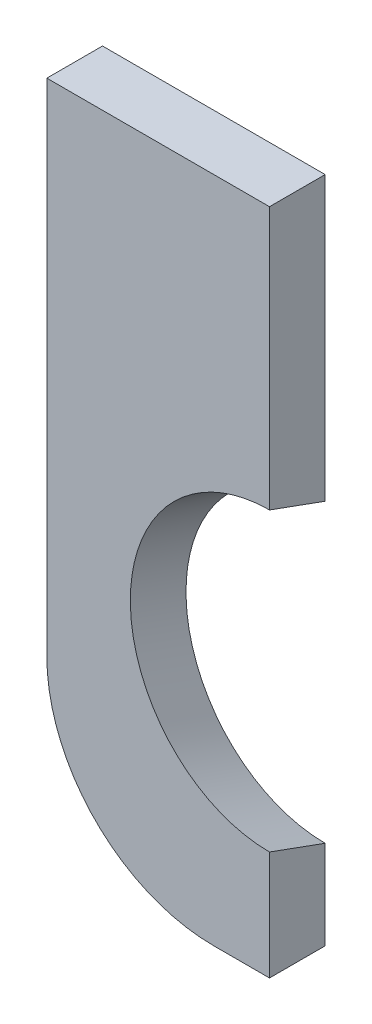
ISO-10303-21;
HEADER;
FILE_DESCRIPTION(('STEP AP214'),'2;1');
FILE_NAME('part.step','',(''),(''),'','','');
FILE_SCHEMA(('AUTOMOTIVE_DESIGN { 1 0 10303 214 1 1 1 1 }'));
ENDSEC;
DATA;
#1=APPLICATION_CONTEXT('core data for automotive mechanical design processes');
#2=APPLICATION_PROTOCOL_DEFINITION('international standard','automotive_design',2000,#1);
#3=PRODUCT_CONTEXT('',#1,'mechanical');
#4=PRODUCT('Part','Part','',(#3));
#5=PRODUCT_RELATED_PRODUCT_CATEGORY('part','',(#4));
#6=PRODUCT_DEFINITION_FORMATION('','',#4);
#7=PRODUCT_DEFINITION_CONTEXT('part definition',#1,'design');
#8=PRODUCT_DEFINITION('design','',#6,#7);
#9=PRODUCT_DEFINITION_SHAPE('','',#8);
#10=(LENGTH_UNIT() NAMED_UNIT(*) SI_UNIT(.MILLI.,.METRE.));
#11=(NAMED_UNIT(*) PLANE_ANGLE_UNIT() SI_UNIT($,.RADIAN.));
#12=(NAMED_UNIT(*) SI_UNIT($,.STERADIAN.) SOLID_ANGLE_UNIT());
#13=UNCERTAINTY_MEASURE_WITH_UNIT(LENGTH_MEASURE(1.E-05),#10,'distance_accuracy_value','');
#14=(GEOMETRIC_REPRESENTATION_CONTEXT(3) GLOBAL_UNCERTAINTY_ASSIGNED_CONTEXT((#13)) GLOBAL_UNIT_ASSIGNED_CONTEXT((#10,
#11,#12)) REPRESENTATION_CONTEXT('',''));
#15=CARTESIAN_POINT('',(0.,0.,0.));
#16=DIRECTION('',(0.,0.,1.));
#17=DIRECTION('',(1.,0.,0.));
#18=AXIS2_PLACEMENT_3D('',#15,#16,#17);
#19=CARTESIAN_POINT('',(40.,0.,10.));
#20=DIRECTION('',(-1.,0.,0.));
#21=DIRECTION('',(0.,0.,1.));
#22=AXIS2_PLACEMENT_3D('',#19,#20,#21);
#23=PLANE('',#22);
#24=DIRECTION('',(0.,1.,0.));
#25=VECTOR('',#24,1.);
#26=CARTESIAN_POINT('',(40.,0.,10.));
#27=LINE('',#26,#25);
#28=CARTESIAN_POINT('',(40.,72.8112575535963,10.));
#29=VERTEX_POINT('',#28);
#30=CARTESIAN_POINT('',(40.,120.,10.));
#31=VERTEX_POINT('',#30);
#32=EDGE_CURVE('E88',#29,#31,#27,.T.);
#33=ORIENTED_EDGE('',*,*,#32,.F.);
#34=DIRECTION('',(0.,-0.342020143325669,-0.939692620785908));
#35=VECTOR('',#34,1.);
#36=CARTESIAN_POINT('',(40.,78.3312918123781,25.1661694806188));
#37=LINE('',#36,#35);
#38=CARTESIAN_POINT('',(40.,69.1715552109343,0.));
#39=VERTEX_POINT('',#38);
#40=EDGE_CURVE('E145',#29,#39,#37,.T.);
#41=ORIENTED_EDGE('',*,*,#40,.T.);
#42=DIRECTION('',(0.,1.,0.));
#43=VECTOR('',#42,1.);
#44=CARTESIAN_POINT('',(40.,0.,0.));
#45=LINE('',#44,#43);
#46=CARTESIAN_POINT('',(40.,120.,0.));
#47=VERTEX_POINT('',#46);
#48=EDGE_CURVE('E126',#39,#47,#45,.T.);
#49=ORIENTED_EDGE('',*,*,#48,.T.);
#50=DIRECTION('',(0.,0.,-1.));
#51=VECTOR('',#50,1.);
#52=CARTESIAN_POINT('',(40.,120.,10.));
#53=LINE('',#52,#51);
#54=EDGE_CURVE('E41',#31,#47,#53,.T.);
#55=ORIENTED_EDGE('',*,*,#54,.F.);
#56=EDGE_LOOP('',(#33,#41,#49,#55));
#57=FACE_BOUND('',#56,.T.);
#58=ADVANCED_FACE('F33',(#57),#23,.F.);
#59=CARTESIAN_POINT('',(40.,0.,0.));
#60=VERTEX_POINT('',#59);
#61=CARTESIAN_POINT('',(40.,15.9626665871387,0.));
#62=VERTEX_POINT('',#61);
#63=EDGE_CURVE('E122',#60,#62,#45,.T.);
#64=ORIENTED_EDGE('',*,*,#63,.T.);
#65=DIRECTION('',(0.,-0.342020143325669,-0.939692620785908));
#66=VECTOR('',#65,1.);
#67=CARTESIAN_POINT('',(40.,31.3466607730827,42.2671766469023));
#68=LINE('',#67,#66);
#69=CARTESIAN_POINT('',(40.,19.6023689298007,10.));
#70=VERTEX_POINT('',#69);
#71=EDGE_CURVE('E47',#70,#62,#68,.T.);
#72=ORIENTED_EDGE('',*,*,#71,.F.);
#73=CARTESIAN_POINT('',(40.,0.,10.));
#74=VERTEX_POINT('',#73);
#75=EDGE_CURVE('E153',#74,#70,#27,.T.);
#76=ORIENTED_EDGE('',*,*,#75,.F.);
#77=DIRECTION('',(0.,0.,-1.));
#78=VECTOR('',#77,1.);
#79=CARTESIAN_POINT('',(40.,0.,10.));
#80=LINE('',#79,#78);
#81=EDGE_CURVE('E118',#74,#60,#80,.T.);
#82=ORIENTED_EDGE('',*,*,#81,.T.);
#83=EDGE_LOOP('',(#64,#72,#76,#82));
#84=FACE_BOUND('',#83,.T.);
#85=ADVANCED_FACE('F35',(#84),#23,.F.);
#86=CARTESIAN_POINT('',(0.,120.,10.));
#87=DIRECTION('',(0.,-1.,0.));
#88=DIRECTION('',(0.,0.,-1.));
#89=AXIS2_PLACEMENT_3D('',#86,#87,#88);
#90=PLANE('',#89);
#91=DIRECTION('',(-1.,0.,0.));
#92=VECTOR('',#91,1.);
#93=CARTESIAN_POINT('',(0.,120.,0.));
#94=LINE('',#93,#92);
#95=CARTESIAN_POINT('',(0.,120.,0.));
#96=VERTEX_POINT('',#95);
#97=EDGE_CURVE('E125',#47,#96,#94,.T.);
#98=ORIENTED_EDGE('',*,*,#97,.T.);
#99=DIRECTION('',(0.,0.,-1.));
#100=VECTOR('',#99,1.);
#101=CARTESIAN_POINT('',(0.,120.,10.));
#102=LINE('',#101,#100);
#103=CARTESIAN_POINT('',(0.,120.,10.));
#104=VERTEX_POINT('',#103);
#105=EDGE_CURVE('E113',#104,#96,#102,.T.);
#106=ORIENTED_EDGE('',*,*,#105,.F.);
#107=DIRECTION('',(-1.,0.,0.));
#108=VECTOR('',#107,1.);
#109=CARTESIAN_POINT('',(0.,120.,10.));
#110=LINE('',#109,#108);
#111=EDGE_CURVE('E101',#31,#104,#110,.T.);
#112=ORIENTED_EDGE('',*,*,#111,.F.);
#113=ORIENTED_EDGE('',*,*,#54,.T.);
#114=EDGE_LOOP('',(#98,#106,#112,#113));
#115=FACE_BOUND('',#114,.T.);
#116=ADVANCED_FACE('F137',(#115),#90,.F.);
#117=CARTESIAN_POINT('',(0.,30.0000000000002,10.));
#118=DIRECTION('',(1.,0.,0.));
#119=DIRECTION('',(0.,0.,-1.));
#120=AXIS2_PLACEMENT_3D('',#117,#118,#119);
#121=PLANE('',#120);
#122=DIRECTION('',(0.,-1.,0.));
#123=VECTOR('',#122,1.);
#124=CARTESIAN_POINT('',(0.,30.0000000000002,0.));
#125=LINE('',#124,#123);
#126=CARTESIAN_POINT('',(0.,30.0000000000002,0.));
#127=VERTEX_POINT('',#126);
#128=EDGE_CURVE('E110',#96,#127,#125,.T.);
#129=ORIENTED_EDGE('',*,*,#128,.T.);
#130=DIRECTION('',(0.,0.,-1.));
#131=VECTOR('',#130,1.);
#132=CARTESIAN_POINT('',(0.,30.0000000000002,10.));
#133=LINE('',#132,#131);
#134=CARTESIAN_POINT('',(0.,30.0000000000002,10.));
#135=VERTEX_POINT('',#134);
#136=EDGE_CURVE('E107',#135,#127,#133,.T.);
#137=ORIENTED_EDGE('',*,*,#136,.F.);
#138=DIRECTION('',(0.,-1.,0.));
#139=VECTOR('',#138,1.);
#140=CARTESIAN_POINT('',(0.,30.0000000000002,10.));
#141=LINE('',#140,#139);
#142=EDGE_CURVE('E95',#104,#135,#141,.T.);
#143=ORIENTED_EDGE('',*,*,#142,.F.);
#144=ORIENTED_EDGE('',*,*,#105,.T.);
#145=EDGE_LOOP('',(#129,#137,#143,#144));
#146=FACE_BOUND('',#145,.T.);
#147=ADVANCED_FACE('F108',(#146),#121,.F.);
#148=CARTESIAN_POINT('',(30.,30.,10.));
#149=DIRECTION('',(0.,0.,-1.));
#150=DIRECTION('',(-1.,0.,0.));
#151=AXIS2_PLACEMENT_3D('',#148,#149,#150);
#152=CYLINDRICAL_SURFACE('',#151,30.);
#153=CARTESIAN_POINT('',(30.,30.,0.));
#154=DIRECTION('',(0.,0.,1.));
#155=DIRECTION('',(-1.,0.,0.));
#156=AXIS2_PLACEMENT_3D('',#153,#154,#155);
#157=CIRCLE('',#156,30.);
#158=CARTESIAN_POINT('',(30.0000000000002,0.,0.));
#159=VERTEX_POINT('',#158);
#160=EDGE_CURVE('E129',#127,#159,#157,.T.);
#161=ORIENTED_EDGE('',*,*,#160,.T.);
#162=DIRECTION('',(0.,0.,-1.));
#163=VECTOR('',#162,1.);
#164=CARTESIAN_POINT('',(30.0000000000002,0.,10.));
#165=LINE('',#164,#163);
#166=CARTESIAN_POINT('',(30.0000000000002,0.,10.));
#167=VERTEX_POINT('',#166);
#168=EDGE_CURVE('E114',#167,#159,#165,.T.);
#169=ORIENTED_EDGE('',*,*,#168,.F.);
#170=CARTESIAN_POINT('',(30.,30.,10.));
#171=DIRECTION('',(0.,0.,1.));
#172=DIRECTION('',(-1.,0.,0.));
#173=AXIS2_PLACEMENT_3D('',#170,#171,#172);
#174=CIRCLE('',#173,30.);
#175=EDGE_CURVE('E99',#135,#167,#174,.T.);
#176=ORIENTED_EDGE('',*,*,#175,.F.);
#177=ORIENTED_EDGE('',*,*,#136,.T.);
#178=EDGE_LOOP('',(#161,#169,#176,#177));
#179=FACE_BOUND('',#178,.T.);
#180=ADVANCED_FACE('F116',(#179),#152,.T.);
#181=CARTESIAN_POINT('',(30.0000000000002,0.,10.));
#182=DIRECTION('',(0.,1.,0.));
#183=DIRECTION('',(0.,0.,1.));
#184=AXIS2_PLACEMENT_3D('',#181,#182,#183);
#185=PLANE('',#184);
#186=DIRECTION('',(1.,0.,0.));
#187=VECTOR('',#186,1.);
#188=CARTESIAN_POINT('',(30.0000000000002,0.,0.));
#189=LINE('',#188,#187);
#190=EDGE_CURVE('E80',#159,#60,#189,.T.);
#191=ORIENTED_EDGE('',*,*,#190,.T.);
#192=ORIENTED_EDGE('',*,*,#81,.F.);
#193=DIRECTION('',(1.,0.,0.));
#194=VECTOR('',#193,1.);
#195=CARTESIAN_POINT('',(30.0000000000002,0.,10.));
#196=LINE('',#195,#194);
#197=EDGE_CURVE('E56',#167,#74,#196,.T.);
#198=ORIENTED_EDGE('',*,*,#197,.F.);
#199=ORIENTED_EDGE('',*,*,#168,.T.);
#200=EDGE_LOOP('',(#191,#192,#198,#199));
#201=FACE_BOUND('',#200,.T.);
#202=ADVANCED_FACE('F150',(#201),#185,.F.);
#203=CARTESIAN_POINT('',(30.,30.,10.));
#204=DIRECTION('',(0.,0.,-1.));
#205=DIRECTION('',(-1.,0.,0.));
#206=AXIS2_PLACEMENT_3D('',#203,#204,#205);
#207=PLANE('',#206);
#208=ORIENTED_EDGE('',*,*,#75,.T.);
#209=CARTESIAN_POINT('',(40.,46.2068132416985,10.));
#210=DIRECTION('',(0.,0.,-1.));
#211=DIRECTION('',(0.,-1.,0.));
#212=AXIS2_PLACEMENT_3D('',#209,#210,#211);
#213=ELLIPSE('',#212,26.6044443118978,25.);
#214=EDGE_CURVE('E147',#70,#29,#213,.T.);
#215=ORIENTED_EDGE('',*,*,#214,.T.);
#216=ORIENTED_EDGE('',*,*,#32,.T.);
#217=ORIENTED_EDGE('',*,*,#111,.T.);
#218=ORIENTED_EDGE('',*,*,#142,.T.);
#219=ORIENTED_EDGE('',*,*,#175,.T.);
#220=ORIENTED_EDGE('',*,*,#197,.T.);
#221=EDGE_LOOP('',(#208,#215,#216,#217,#218,#219,#220));
#222=FACE_BOUND('',#221,.T.);
#223=ADVANCED_FACE('F97',(#222),#207,.F.);
#224=CARTESIAN_POINT('',(30.,30.,0.));
#225=DIRECTION('',(0.,0.,-1.));
#226=DIRECTION('',(-1.,0.,0.));
#227=AXIS2_PLACEMENT_3D('',#224,#225,#226);
#228=PLANE('',#227);
#229=CARTESIAN_POINT('',(40.,42.5671108990365,0.));
#230=DIRECTION('',(0.,0.,-1.));
#231=DIRECTION('',(0.,-1.,0.));
#232=AXIS2_PLACEMENT_3D('',#229,#230,#231);
#233=ELLIPSE('',#232,26.6044443118978,25.);
#234=EDGE_CURVE('E11',#62,#39,#233,.T.);
#235=ORIENTED_EDGE('',*,*,#234,.F.);
#236=ORIENTED_EDGE('',*,*,#63,.F.);
#237=ORIENTED_EDGE('',*,*,#190,.F.);
#238=ORIENTED_EDGE('',*,*,#160,.F.);
#239=ORIENTED_EDGE('',*,*,#128,.F.);
#240=ORIENTED_EDGE('',*,*,#97,.F.);
#241=ORIENTED_EDGE('',*,*,#48,.F.);
#242=EDGE_LOOP('',(#235,#236,#237,#238,#239,#240,#241));
#243=FACE_BOUND('',#242,.T.);
#244=ADVANCED_FACE('F148',(#243),#228,.T.);
#245=CARTESIAN_POINT('',(40.,54.8389762927304,33.7166730637605));
#246=DIRECTION('',(0.,-0.342020143325669,-0.939692620785908));
#247=DIRECTION('',(0.,0.939692620785908,-0.342020143325669));
#248=AXIS2_PLACEMENT_3D('',#245,#246,#247);
#249=CYLINDRICAL_SURFACE('',#248,25.);
#250=ORIENTED_EDGE('',*,*,#71,.T.);
#251=ORIENTED_EDGE('',*,*,#234,.T.);
#252=ORIENTED_EDGE('',*,*,#40,.F.);
#253=ORIENTED_EDGE('',*,*,#214,.F.);
#254=EDGE_LOOP('',(#250,#251,#252,#253));
#255=FACE_BOUND('',#254,.T.);
#256=ADVANCED_FACE('F159',(#255),#249,.F.);
#257=CLOSED_SHELL('',(#58,#85,#116,#147,#180,#202,#223,#244,#256));
#258=MANIFOLD_SOLID_BREP('B2',#257);
#259=ADVANCED_BREP_SHAPE_REPRESENTATION('',(#18,#258),#14);
#260=SHAPE_DEFINITION_REPRESENTATION(#9,#259);
ENDSEC;
END-ISO-10303-21;
